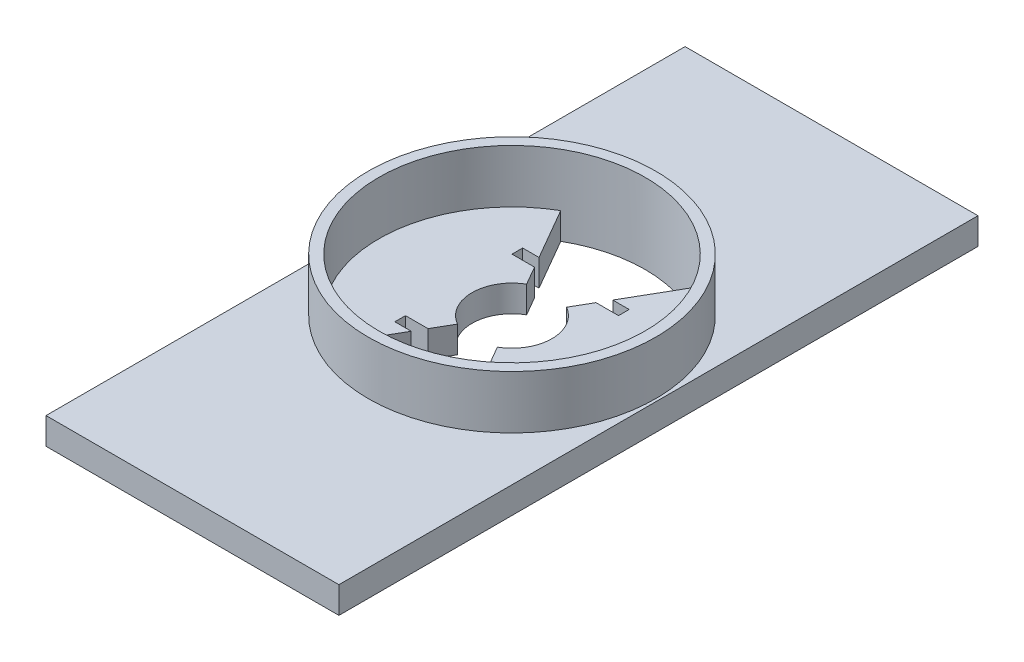
ISO-10303-21;
HEADER;
FILE_DESCRIPTION(('STEP AP214'),'2;1');
FILE_NAME('part.step','',(''),(''),'','','');
FILE_SCHEMA(('AUTOMOTIVE_DESIGN { 1 0 10303 214 1 1 1 1 }'));
ENDSEC;
DATA;
#1=APPLICATION_CONTEXT('core data for automotive mechanical design processes');
#2=APPLICATION_PROTOCOL_DEFINITION('international standard','automotive_design',2000,#1);
#3=PRODUCT_CONTEXT('',#1,'mechanical');
#4=PRODUCT('Part','Part','',(#3));
#5=PRODUCT_RELATED_PRODUCT_CATEGORY('part','',(#4));
#6=PRODUCT_DEFINITION_FORMATION('','',#4);
#7=PRODUCT_DEFINITION_CONTEXT('part definition',#1,'design');
#8=PRODUCT_DEFINITION('design','',#6,#7);
#9=PRODUCT_DEFINITION_SHAPE('','',#8);
#10=(LENGTH_UNIT() NAMED_UNIT(*) SI_UNIT(.MILLI.,.METRE.));
#11=(NAMED_UNIT(*) PLANE_ANGLE_UNIT() SI_UNIT($,.RADIAN.));
#12=(NAMED_UNIT(*) SI_UNIT($,.STERADIAN.) SOLID_ANGLE_UNIT());
#13=UNCERTAINTY_MEASURE_WITH_UNIT(LENGTH_MEASURE(1.E-05),#10,'distance_accuracy_value','');
#14=(GEOMETRIC_REPRESENTATION_CONTEXT(3) GLOBAL_UNCERTAINTY_ASSIGNED_CONTEXT((#13)) GLOBAL_UNIT_ASSIGNED_CONTEXT((#10,
#11,#12)) REPRESENTATION_CONTEXT('',''));
#15=CARTESIAN_POINT('',(0.,0.,0.));
#16=DIRECTION('',(0.,0.,1.));
#17=DIRECTION('',(1.,0.,0.));
#18=AXIS2_PLACEMENT_3D('',#15,#16,#17);
#19=CARTESIAN_POINT('',(0.,5.,0.));
#20=DIRECTION('',(0.,1.,0.));
#21=DIRECTION('',(0.,0.,1.));
#22=AXIS2_PLACEMENT_3D('',#19,#20,#21);
#23=PLANE('',#22);
#24=DIRECTION('',(0.,0.,-1.));
#25=VECTOR('',#24,1.);
#26=CARTESIAN_POINT('',(-27.5,5.,60.));
#27=LINE('',#26,#25);
#28=CARTESIAN_POINT('',(-27.5,5.,60.));
#29=VERTEX_POINT('',#28);
#30=CARTESIAN_POINT('',(-27.5,5.,-60.));
#31=VERTEX_POINT('',#30);
#32=EDGE_CURVE('E215',#29,#31,#27,.T.);
#33=ORIENTED_EDGE('',*,*,#32,.F.);
#34=DIRECTION('',(1.,0.,0.));
#35=VECTOR('',#34,1.);
#36=CARTESIAN_POINT('',(-51.,5.,60.));
#37=LINE('',#36,#35);
#38=CARTESIAN_POINT('',(27.5,5.,60.));
#39=VERTEX_POINT('',#38);
#40=EDGE_CURVE('E234',#29,#39,#37,.T.);
#41=ORIENTED_EDGE('',*,*,#40,.T.);
#42=DIRECTION('',(0.,0.,-1.));
#43=VECTOR('',#42,1.);
#44=CARTESIAN_POINT('',(27.5,5.,60.));
#45=LINE('',#44,#43);
#46=CARTESIAN_POINT('',(27.5,5.,-60.));
#47=VERTEX_POINT('',#46);
#48=EDGE_CURVE('E48',#39,#47,#45,.T.);
#49=ORIENTED_EDGE('',*,*,#48,.T.);
#50=DIRECTION('',(-1.,0.,0.));
#51=VECTOR('',#50,1.);
#52=CARTESIAN_POINT('',(-51.,5.,-60.));
#53=LINE('',#52,#51);
#54=EDGE_CURVE('E228',#47,#31,#53,.T.);
#55=ORIENTED_EDGE('',*,*,#54,.T.);
#56=EDGE_LOOP('',(#33,#41,#49,#55));
#57=FACE_BOUND('',#56,.T.);
#58=CARTESIAN_POINT('',(0.,5.,0.));
#59=DIRECTION('',(0.,1.,0.));
#60=DIRECTION('',(0.,0.,1.));
#61=AXIS2_PLACEMENT_3D('',#58,#59,#60);
#62=CIRCLE('',#61,27.);
#63=CARTESIAN_POINT('',(0.,5.,27.));
#64=VERTEX_POINT('',#63);
#65=EDGE_CURVE('E266',#64,#64,#62,.T.);
#66=ORIENTED_EDGE('',*,*,#65,.F.);
#67=EDGE_LOOP('',(#66));
#68=FACE_BOUND('',#67,.T.);
#69=ADVANCED_FACE('F33',(#57,#68),#23,.T.);
#70=CARTESIAN_POINT('',(0.,0.,0.));
#71=DIRECTION('',(0.,1.,0.));
#72=DIRECTION('',(0.,0.,1.));
#73=AXIS2_PLACEMENT_3D('',#70,#71,#72);
#74=PLANE('',#73);
#75=DIRECTION('',(0.499999999999998,0.,0.86602540378444));
#76=VECTOR('',#75,1.);
#77=CARTESIAN_POINT('',(0.,0.,0.));
#78=LINE('',#77,#76);
#79=CARTESIAN_POINT('',(6.92820323027538,0.,11.9999999999998));
#80=VERTEX_POINT('',#79);
#81=CARTESIAN_POINT('',(12.4999999999999,0.,21.650635094611));
#82=VERTEX_POINT('',#81);
#83=EDGE_CURVE('E337',#80,#82,#78,.T.);
#84=ORIENTED_EDGE('',*,*,#83,.F.);
#85=DIRECTION('',(1.,0.,0.));
#86=VECTOR('',#85,1.);
#87=CARTESIAN_POINT('',(-9.99999999999997,0.,11.9999999999998));
#88=LINE('',#87,#86);
#89=CARTESIAN_POINT('',(10.,0.,11.9999999999998));
#90=VERTEX_POINT('',#89);
#91=EDGE_CURVE('E396',#80,#90,#88,.T.);
#92=ORIENTED_EDGE('',*,*,#91,.T.);
#93=DIRECTION('',(0.,0.,-1.));
#94=VECTOR('',#93,1.);
#95=CARTESIAN_POINT('',(10.,0.,11.9999999999998));
#96=LINE('',#95,#94);
#97=CARTESIAN_POINT('',(10.,0.,9.99999999999984));
#98=VERTEX_POINT('',#97);
#99=EDGE_CURVE('E400',#90,#98,#96,.T.);
#100=ORIENTED_EDGE('',*,*,#99,.T.);
#101=DIRECTION('',(-1.,0.,0.));
#102=VECTOR('',#101,1.);
#103=CARTESIAN_POINT('',(-9.99999999999997,0.,9.99999999999984));
#104=LINE('',#103,#102);
#105=CARTESIAN_POINT('',(5.77350269189613,0.,9.99999999999984));
#106=VERTEX_POINT('',#105);
#107=EDGE_CURVE('E382',#98,#106,#104,.T.);
#108=ORIENTED_EDGE('',*,*,#107,.T.);
#109=CARTESIAN_POINT('',(3.74999999999998,0.,6.4951905283833));
#110=VERTEX_POINT('',#109);
#111=EDGE_CURVE('E334',#110,#106,#78,.T.);
#112=ORIENTED_EDGE('',*,*,#111,.F.);
#113=CARTESIAN_POINT('',(0.,0.,0.));
#114=DIRECTION('',(0.,1.,0.));
#115=DIRECTION('',(0.,0.,1.));
#116=AXIS2_PLACEMENT_3D('',#113,#114,#115);
#117=CIRCLE('',#116,7.5);
#118=CARTESIAN_POINT('',(3.75000000000002,0.,-6.49519052838328));
#119=VERTEX_POINT('',#118);
#120=EDGE_CURVE('E258',#110,#119,#117,.T.);
#121=ORIENTED_EDGE('',*,*,#120,.T.);
#122=DIRECTION('',(0.499999999999996,0.,-0.866025403784441));
#123=VECTOR('',#122,1.);
#124=CARTESIAN_POINT('',(0.,0.,0.));
#125=LINE('',#124,#123);
#126=CARTESIAN_POINT('',(5.77350269189606,0.,-9.99999999999965));
#127=VERTEX_POINT('',#126);
#128=EDGE_CURVE('E320',#119,#127,#125,.T.);
#129=ORIENTED_EDGE('',*,*,#128,.T.);
#130=DIRECTION('',(1.,0.,0.));
#131=VECTOR('',#130,1.);
#132=CARTESIAN_POINT('',(-10.,0.,-9.99999999999965));
#133=LINE('',#132,#131);
#134=CARTESIAN_POINT('',(10.,0.,-9.99999999999965));
#135=VERTEX_POINT('',#134);
#136=EDGE_CURVE('E358',#127,#135,#133,.T.);
#137=ORIENTED_EDGE('',*,*,#136,.T.);
#138=DIRECTION('',(0.,0.,-1.));
#139=VECTOR('',#138,1.);
#140=CARTESIAN_POINT('',(10.,0.,-9.99999999999965));
#141=LINE('',#140,#139);
#142=CARTESIAN_POINT('',(10.,0.,-11.9999999999997));
#143=VERTEX_POINT('',#142);
#144=EDGE_CURVE('E362',#135,#143,#141,.T.);
#145=ORIENTED_EDGE('',*,*,#144,.T.);
#146=DIRECTION('',(-1.,0.,0.));
#147=VECTOR('',#146,1.);
#148=CARTESIAN_POINT('',(-10.,0.,-11.9999999999997));
#149=LINE('',#148,#147);
#150=CARTESIAN_POINT('',(6.9282032302753,0.,-11.9999999999997));
#151=VERTEX_POINT('',#150);
#152=EDGE_CURVE('E343',#143,#151,#149,.T.);
#153=ORIENTED_EDGE('',*,*,#152,.T.);
#154=CARTESIAN_POINT('',(12.4999999999999,0.,-21.650635094611));
#155=VERTEX_POINT('',#154);
#156=EDGE_CURVE('E301',#151,#155,#125,.T.);
#157=ORIENTED_EDGE('',*,*,#156,.T.);
#158=CARTESIAN_POINT('',(0.,0.,0.));
#159=DIRECTION('',(0.,1.,0.));
#160=DIRECTION('',(0.,0.,1.));
#161=AXIS2_PLACEMENT_3D('',#158,#159,#160);
#162=CIRCLE('',#161,25.);
#163=CARTESIAN_POINT('',(-12.5000000000001,0.,-21.6506350946109));
#164=VERTEX_POINT('',#163);
#165=EDGE_CURVE('E255',#155,#164,#162,.T.);
#166=ORIENTED_EDGE('',*,*,#165,.T.);
#167=DIRECTION('',(-0.500000000000004,0.,-0.866025403784436));
#168=VECTOR('',#167,1.);
#169=CARTESIAN_POINT('',(0.,0.,0.));
#170=LINE('',#169,#168);
#171=CARTESIAN_POINT('',(-6.92820323027539,0.,-11.9999999999997));
#172=VERTEX_POINT('',#171);
#173=EDGE_CURVE('E322',#172,#164,#170,.T.);
#174=ORIENTED_EDGE('',*,*,#173,.F.);
#175=CARTESIAN_POINT('',(-10.,0.,-11.9999999999997));
#176=VERTEX_POINT('',#175);
#177=EDGE_CURVE('E365',#172,#176,#149,.T.);
#178=ORIENTED_EDGE('',*,*,#177,.T.);
#179=DIRECTION('',(0.,0.,1.));
#180=VECTOR('',#179,1.);
#181=CARTESIAN_POINT('',(-10.,0.,-9.99999999999965));
#182=LINE('',#181,#180);
#183=CARTESIAN_POINT('',(-10.,0.,-9.99999999999965));
#184=VERTEX_POINT('',#183);
#185=EDGE_CURVE('E355',#176,#184,#182,.T.);
#186=ORIENTED_EDGE('',*,*,#185,.T.);
#187=CARTESIAN_POINT('',(-5.77350269189612,0.,-9.99999999999965));
#188=VERTEX_POINT('',#187);
#189=EDGE_CURVE('E359',#184,#188,#133,.T.);
#190=ORIENTED_EDGE('',*,*,#189,.T.);
#191=CARTESIAN_POINT('',(-3.75000000000003,0.,-6.49519052838327));
#192=VERTEX_POINT('',#191);
#193=EDGE_CURVE('E325',#192,#188,#170,.T.);
#194=ORIENTED_EDGE('',*,*,#193,.F.);
#195=CARTESIAN_POINT('',(0.,0.,0.));
#196=DIRECTION('',(0.,1.,0.));
#197=DIRECTION('',(0.,0.,1.));
#198=AXIS2_PLACEMENT_3D('',#195,#196,#197);
#199=CIRCLE('',#198,7.5);
#200=CARTESIAN_POINT('',(-3.75000000000003,0.,6.49519052838327));
#201=VERTEX_POINT('',#200);
#202=EDGE_CURVE('E261',#192,#201,#199,.T.);
#203=ORIENTED_EDGE('',*,*,#202,.T.);
#204=DIRECTION('',(-0.500000000000004,0.,0.866025403784436));
#205=VECTOR('',#204,1.);
#206=CARTESIAN_POINT('',(0.,0.,0.));
#207=LINE('',#206,#205);
#208=CARTESIAN_POINT('',(-5.77350269189623,0.,9.99999999999984));
#209=VERTEX_POINT('',#208);
#210=EDGE_CURVE('E328',#201,#209,#207,.T.);
#211=ORIENTED_EDGE('',*,*,#210,.T.);
#212=CARTESIAN_POINT('',(-9.99999999999997,0.,9.99999999999984));
#213=VERTEX_POINT('',#212);
#214=EDGE_CURVE('E403',#209,#213,#104,.T.);
#215=ORIENTED_EDGE('',*,*,#214,.T.);
#216=DIRECTION('',(0.,0.,1.));
#217=VECTOR('',#216,1.);
#218=CARTESIAN_POINT('',(-9.99999999999997,0.,11.9999999999998));
#219=LINE('',#218,#217);
#220=CARTESIAN_POINT('',(-9.99999999999997,0.,11.9999999999998));
#221=VERTEX_POINT('',#220);
#222=EDGE_CURVE('E378',#213,#221,#219,.T.);
#223=ORIENTED_EDGE('',*,*,#222,.T.);
#224=CARTESIAN_POINT('',(-6.9282032302755,0.,11.9999999999998));
#225=VERTEX_POINT('',#224);
#226=EDGE_CURVE('E397',#221,#225,#88,.T.);
#227=ORIENTED_EDGE('',*,*,#226,.T.);
#228=CARTESIAN_POINT('',(-12.5000000000001,0.,21.6506350946109));
#229=VERTEX_POINT('',#228);
#230=EDGE_CURVE('E332',#225,#229,#207,.T.);
#231=ORIENTED_EDGE('',*,*,#230,.T.);
#232=CARTESIAN_POINT('',(0.,0.,0.));
#233=DIRECTION('',(0.,1.,0.));
#234=DIRECTION('',(0.,0.,1.));
#235=AXIS2_PLACEMENT_3D('',#232,#233,#234);
#236=CIRCLE('',#235,25.);
#237=EDGE_CURVE('E264',#82,#229,#236,.F.);
#238=ORIENTED_EDGE('',*,*,#237,.F.);
#239=EDGE_LOOP('',(#84,#92,#100,#108,#112,#121,#129,#137,#145,#153,#157,#166,#174,#178,#186,
#190,#194,#203,#211,#215,#223,#227,#231,#238));
#240=FACE_BOUND('',#239,.T.);
#241=DIRECTION('',(1.,0.,0.));
#242=VECTOR('',#241,1.);
#243=CARTESIAN_POINT('',(-51.,0.,60.));
#244=LINE('',#243,#242);
#245=CARTESIAN_POINT('',(-27.5,0.,60.));
#246=VERTEX_POINT('',#245);
#247=CARTESIAN_POINT('',(27.5,0.,60.));
#248=VERTEX_POINT('',#247);
#249=EDGE_CURVE('E235',#246,#248,#244,.T.);
#250=ORIENTED_EDGE('',*,*,#249,.F.);
#251=DIRECTION('',(0.,0.,-1.));
#252=VECTOR('',#251,1.);
#253=CARTESIAN_POINT('',(-27.5,0.,0.));
#254=LINE('',#253,#252);
#255=CARTESIAN_POINT('',(-27.5,0.,-60.));
#256=VERTEX_POINT('',#255);
#257=EDGE_CURVE('E56',#246,#256,#254,.T.);
#258=ORIENTED_EDGE('',*,*,#257,.T.);
#259=DIRECTION('',(-1.,0.,0.));
#260=VECTOR('',#259,1.);
#261=CARTESIAN_POINT('',(-51.,0.,-60.));
#262=LINE('',#261,#260);
#263=CARTESIAN_POINT('',(27.5,0.,-60.));
#264=VERTEX_POINT('',#263);
#265=EDGE_CURVE('E230',#264,#256,#262,.T.);
#266=ORIENTED_EDGE('',*,*,#265,.F.);
#267=DIRECTION('',(0.,0.,-1.));
#268=VECTOR('',#267,1.);
#269=CARTESIAN_POINT('',(27.5,0.,0.));
#270=LINE('',#269,#268);
#271=EDGE_CURVE('E231',#248,#264,#270,.T.);
#272=ORIENTED_EDGE('',*,*,#271,.F.);
#273=EDGE_LOOP('',(#250,#258,#266,#272));
#274=FACE_BOUND('',#273,.T.);
#275=ADVANCED_FACE('F426',(#240,#274),#74,.F.);
#276=CARTESIAN_POINT('',(-51.,5.,-60.));
#277=DIRECTION('',(0.,0.,1.));
#278=DIRECTION('',(1.,0.,0.));
#279=AXIS2_PLACEMENT_3D('',#276,#277,#278);
#280=PLANE('',#279);
#281=ORIENTED_EDGE('',*,*,#265,.T.);
#282=DIRECTION('',(0.,1.,0.));
#283=VECTOR('',#282,1.);
#284=CARTESIAN_POINT('',(-27.5,-5.,-60.));
#285=LINE('',#284,#283);
#286=EDGE_CURVE('E218',#256,#31,#285,.T.);
#287=ORIENTED_EDGE('',*,*,#286,.T.);
#288=ORIENTED_EDGE('',*,*,#54,.F.);
#289=DIRECTION('',(0.,1.,0.));
#290=VECTOR('',#289,1.);
#291=CARTESIAN_POINT('',(27.5,-5.,-60.));
#292=LINE('',#291,#290);
#293=EDGE_CURVE('E750',#264,#47,#292,.T.);
#294=ORIENTED_EDGE('',*,*,#293,.F.);
#295=EDGE_LOOP('',(#281,#287,#288,#294));
#296=FACE_BOUND('',#295,.T.);
#297=ADVANCED_FACE('F35',(#296),#280,.F.);
#298=CARTESIAN_POINT('',(-51.,5.,60.));
#299=DIRECTION('',(0.,0.,-1.));
#300=DIRECTION('',(-1.,0.,0.));
#301=AXIS2_PLACEMENT_3D('',#298,#299,#300);
#302=PLANE('',#301);
#303=ORIENTED_EDGE('',*,*,#40,.F.);
#304=DIRECTION('',(0.,-1.,0.));
#305=VECTOR('',#304,1.);
#306=CARTESIAN_POINT('',(-27.5,5.,60.));
#307=LINE('',#306,#305);
#308=EDGE_CURVE('E11',#29,#246,#307,.T.);
#309=ORIENTED_EDGE('',*,*,#308,.T.);
#310=ORIENTED_EDGE('',*,*,#249,.T.);
#311=DIRECTION('',(0.,-1.,0.));
#312=VECTOR('',#311,1.);
#313=CARTESIAN_POINT('',(27.5,5.,60.));
#314=LINE('',#313,#312);
#315=EDGE_CURVE('E41',#39,#248,#314,.T.);
#316=ORIENTED_EDGE('',*,*,#315,.F.);
#317=EDGE_LOOP('',(#303,#309,#310,#316));
#318=FACE_BOUND('',#317,.T.);
#319=ADVANCED_FACE('F545',(#318),#302,.F.);
#320=DIRECTION('',(0.499999999999998,0.,0.86602540378444));
#321=VECTOR('',#320,1.);
#322=CARTESIAN_POINT('',(3.74999999999998,5.,6.4951905283833));
#323=LINE('',#322,#321);
#324=CARTESIAN_POINT('',(6.92820323027538,5.,11.9999999999998));
#325=VERTEX_POINT('',#324);
#326=CARTESIAN_POINT('',(12.4999999999999,5.,21.650635094611));
#327=VERTEX_POINT('',#326);
#328=EDGE_CURVE('E294',#325,#327,#323,.T.);
#329=ORIENTED_EDGE('',*,*,#328,.T.);
#330=CARTESIAN_POINT('',(0.,5.,0.));
#331=DIRECTION('',(0.,1.,0.));
#332=DIRECTION('',(0.,0.,1.));
#333=AXIS2_PLACEMENT_3D('',#330,#331,#332);
#334=CIRCLE('',#333,25.);
#335=CARTESIAN_POINT('',(12.4999999999999,5.,-21.650635094611));
#336=VERTEX_POINT('',#335);
#337=EDGE_CURVE('E274',#327,#336,#334,.T.);
#338=ORIENTED_EDGE('',*,*,#337,.T.);
#339=DIRECTION('',(0.499999999999996,0.,-0.866025403784441));
#340=VECTOR('',#339,1.);
#341=CARTESIAN_POINT('',(3.75000000000002,5.,-6.49519052838328));
#342=LINE('',#341,#340);
#343=CARTESIAN_POINT('',(6.9282032302753,5.,-11.9999999999997));
#344=VERTEX_POINT('',#343);
#345=EDGE_CURVE('E281',#344,#336,#342,.T.);
#346=ORIENTED_EDGE('',*,*,#345,.F.);
#347=DIRECTION('',(-1.,0.,0.));
#348=VECTOR('',#347,1.);
#349=CARTESIAN_POINT('',(-10.,5.,-11.9999999999997));
#350=LINE('',#349,#348);
#351=CARTESIAN_POINT('',(10.,5.,-11.9999999999997));
#352=VERTEX_POINT('',#351);
#353=EDGE_CURVE('E351',#352,#344,#350,.T.);
#354=ORIENTED_EDGE('',*,*,#353,.F.);
#355=DIRECTION('',(0.,0.,-1.));
#356=VECTOR('',#355,1.);
#357=CARTESIAN_POINT('',(10.,5.,-9.99999999999965));
#358=LINE('',#357,#356);
#359=CARTESIAN_POINT('',(10.,5.,-9.99999999999965));
#360=VERTEX_POINT('',#359);
#361=EDGE_CURVE('E347',#360,#352,#358,.T.);
#362=ORIENTED_EDGE('',*,*,#361,.F.);
#363=DIRECTION('',(1.,0.,0.));
#364=VECTOR('',#363,1.);
#365=CARTESIAN_POINT('',(-10.,5.,-9.99999999999965));
#366=LINE('',#365,#364);
#367=CARTESIAN_POINT('',(5.77350269189606,5.,-9.99999999999965));
#368=VERTEX_POINT('',#367);
#369=EDGE_CURVE('E342',#368,#360,#366,.T.);
#370=ORIENTED_EDGE('',*,*,#369,.F.);
#371=CARTESIAN_POINT('',(3.75000000000002,5.,-6.49519052838328));
#372=VERTEX_POINT('',#371);
#373=EDGE_CURVE('E282',#372,#368,#342,.T.);
#374=ORIENTED_EDGE('',*,*,#373,.F.);
#375=CARTESIAN_POINT('',(0.,5.,0.));
#376=DIRECTION('',(0.,1.,0.));
#377=DIRECTION('',(0.,0.,1.));
#378=AXIS2_PLACEMENT_3D('',#375,#376,#377);
#379=CIRCLE('',#378,7.5);
#380=CARTESIAN_POINT('',(3.74999999999998,5.,6.4951905283833));
#381=VERTEX_POINT('',#380);
#382=EDGE_CURVE('E278',#381,#372,#379,.T.);
#383=ORIENTED_EDGE('',*,*,#382,.F.);
#384=CARTESIAN_POINT('',(5.77350269189613,5.,9.99999999999984));
#385=VERTEX_POINT('',#384);
#386=EDGE_CURVE('E295',#381,#385,#323,.T.);
#387=ORIENTED_EDGE('',*,*,#386,.T.);
#388=DIRECTION('',(-1.,0.,0.));
#389=VECTOR('',#388,1.);
#390=CARTESIAN_POINT('',(-9.99999999999997,5.,9.99999999999984));
#391=LINE('',#390,#389);
#392=CARTESIAN_POINT('',(10.,5.,9.99999999999984));
#393=VERTEX_POINT('',#392);
#394=EDGE_CURVE('E390',#393,#385,#391,.T.);
#395=ORIENTED_EDGE('',*,*,#394,.F.);
#396=DIRECTION('',(0.,0.,-1.));
#397=VECTOR('',#396,1.);
#398=CARTESIAN_POINT('',(10.,5.,11.9999999999998));
#399=LINE('',#398,#397);
#400=CARTESIAN_POINT('',(10.,5.,11.9999999999998));
#401=VERTEX_POINT('',#400);
#402=EDGE_CURVE('E386',#401,#393,#399,.T.);
#403=ORIENTED_EDGE('',*,*,#402,.F.);
#404=DIRECTION('',(1.,0.,0.));
#405=VECTOR('',#404,1.);
#406=CARTESIAN_POINT('',(-9.99999999999997,5.,11.9999999999998));
#407=LINE('',#406,#405);
#408=EDGE_CURVE('E381',#325,#401,#407,.T.);
#409=ORIENTED_EDGE('',*,*,#408,.F.);
#410=EDGE_LOOP('',(#329,#338,#346,#354,#362,#370,#374,#383,#387,#395,#403,#409));
#411=FACE_BOUND('',#410,.T.);
#412=ADVANCED_FACE('F456',(#411),#23,.T.);
#413=DIRECTION('',(-0.500000000000004,0.,-0.866025403784436));
#414=VECTOR('',#413,1.);
#415=CARTESIAN_POINT('',(-3.75000000000003,5.,-6.49519052838327));
#416=LINE('',#415,#414);
#417=CARTESIAN_POINT('',(-6.92820323027539,5.,-11.9999999999997));
#418=VERTEX_POINT('',#417);
#419=CARTESIAN_POINT('',(-12.5000000000001,5.,-21.6506350946109));
#420=VERTEX_POINT('',#419);
#421=EDGE_CURVE('E284',#418,#420,#416,.T.);
#422=ORIENTED_EDGE('',*,*,#421,.T.);
#423=CARTESIAN_POINT('',(-12.5000000000001,5.,21.6506350946109));
#424=VERTEX_POINT('',#423);
#425=EDGE_CURVE('E265',#420,#424,#334,.T.);
#426=ORIENTED_EDGE('',*,*,#425,.T.);
#427=DIRECTION('',(-0.500000000000004,0.,0.866025403784436));
#428=VECTOR('',#427,1.);
#429=CARTESIAN_POINT('',(-3.75000000000003,5.,6.49519052838327));
#430=LINE('',#429,#428);
#431=CARTESIAN_POINT('',(-6.9282032302755,5.,11.9999999999998));
#432=VERTEX_POINT('',#431);
#433=EDGE_CURVE('E291',#432,#424,#430,.T.);
#434=ORIENTED_EDGE('',*,*,#433,.F.);
#435=CARTESIAN_POINT('',(-9.99999999999997,5.,11.9999999999998));
#436=VERTEX_POINT('',#435);
#437=EDGE_CURVE('E383',#436,#432,#407,.T.);
#438=ORIENTED_EDGE('',*,*,#437,.F.);
#439=DIRECTION('',(0.,0.,1.));
#440=VECTOR('',#439,1.);
#441=CARTESIAN_POINT('',(-9.99999999999997,5.,11.9999999999998));
#442=LINE('',#441,#440);
#443=CARTESIAN_POINT('',(-9.99999999999997,5.,9.99999999999984));
#444=VERTEX_POINT('',#443);
#445=EDGE_CURVE('E379',#444,#436,#442,.T.);
#446=ORIENTED_EDGE('',*,*,#445,.F.);
#447=CARTESIAN_POINT('',(-5.77350269189623,5.,9.99999999999984));
#448=VERTEX_POINT('',#447);
#449=EDGE_CURVE('E389',#448,#444,#391,.T.);
#450=ORIENTED_EDGE('',*,*,#449,.F.);
#451=CARTESIAN_POINT('',(-3.75000000000003,5.,6.49519052838327));
#452=VERTEX_POINT('',#451);
#453=EDGE_CURVE('E292',#452,#448,#430,.T.);
#454=ORIENTED_EDGE('',*,*,#453,.F.);
#455=CARTESIAN_POINT('',(0.,5.,0.));
#456=DIRECTION('',(0.,1.,0.));
#457=DIRECTION('',(0.,0.,1.));
#458=AXIS2_PLACEMENT_3D('',#455,#456,#457);
#459=CIRCLE('',#458,7.5);
#460=CARTESIAN_POINT('',(-3.75000000000003,5.,-6.49519052838327));
#461=VERTEX_POINT('',#460);
#462=EDGE_CURVE('E288',#461,#452,#459,.T.);
#463=ORIENTED_EDGE('',*,*,#462,.F.);
#464=CARTESIAN_POINT('',(-5.77350269189612,5.,-9.99999999999965));
#465=VERTEX_POINT('',#464);
#466=EDGE_CURVE('E285',#461,#465,#416,.T.);
#467=ORIENTED_EDGE('',*,*,#466,.T.);
#468=CARTESIAN_POINT('',(-10.,5.,-9.99999999999965));
#469=VERTEX_POINT('',#468);
#470=EDGE_CURVE('E344',#469,#465,#366,.T.);
#471=ORIENTED_EDGE('',*,*,#470,.F.);
#472=DIRECTION('',(0.,0.,1.));
#473=VECTOR('',#472,1.);
#474=CARTESIAN_POINT('',(-10.,5.,-9.99999999999965));
#475=LINE('',#474,#473);
#476=CARTESIAN_POINT('',(-10.,5.,-11.9999999999997));
#477=VERTEX_POINT('',#476);
#478=EDGE_CURVE('E340',#477,#469,#475,.T.);
#479=ORIENTED_EDGE('',*,*,#478,.F.);
#480=EDGE_CURVE('E350',#418,#477,#350,.T.);
#481=ORIENTED_EDGE('',*,*,#480,.F.);
#482=EDGE_LOOP('',(#422,#426,#434,#438,#446,#450,#454,#463,#467,#471,#479,#481));
#483=FACE_BOUND('',#482,.T.);
#484=ADVANCED_FACE('F436',(#483),#23,.T.);
#485=CARTESIAN_POINT('',(-9.99999999999997,5.,11.9999999999998));
#486=DIRECTION('',(0.,0.,-1.));
#487=DIRECTION('',(-1.,0.,0.));
#488=AXIS2_PLACEMENT_3D('',#485,#486,#487);
#489=PLANE('',#488);
#490=ORIENTED_EDGE('',*,*,#91,.F.);
#491=DIRECTION('',(0.,1.,0.));
#492=VECTOR('',#491,1.);
#493=CARTESIAN_POINT('',(6.92820323027538,5.,11.9999999999998));
#494=LINE('',#493,#492);
#495=EDGE_CURVE('E336',#80,#325,#494,.T.);
#496=ORIENTED_EDGE('',*,*,#495,.T.);
#497=ORIENTED_EDGE('',*,*,#408,.T.);
#498=DIRECTION('',(0.,-1.,0.));
#499=VECTOR('',#498,1.);
#500=CARTESIAN_POINT('',(10.,5.,11.9999999999998));
#501=LINE('',#500,#499);
#502=EDGE_CURVE('E409',#401,#90,#501,.T.);
#503=ORIENTED_EDGE('',*,*,#502,.T.);
#504=EDGE_LOOP('',(#490,#496,#497,#503));
#505=FACE_BOUND('',#504,.T.);
#506=ADVANCED_FACE('F460',(#505),#489,.T.);
#507=CARTESIAN_POINT('',(-9.99999999999997,5.,9.99999999999984));
#508=DIRECTION('',(0.,0.,1.));
#509=DIRECTION('',(1.,0.,0.));
#510=AXIS2_PLACEMENT_3D('',#507,#508,#509);
#511=PLANE('',#510);
#512=ORIENTED_EDGE('',*,*,#394,.T.);
#513=DIRECTION('',(0.,-1.,0.));
#514=VECTOR('',#513,1.);
#515=CARTESIAN_POINT('',(5.77350269189613,5.,9.99999999999984));
#516=LINE('',#515,#514);
#517=EDGE_CURVE('E252',#385,#106,#516,.T.);
#518=ORIENTED_EDGE('',*,*,#517,.T.);
#519=ORIENTED_EDGE('',*,*,#107,.F.);
#520=DIRECTION('',(0.,-1.,0.));
#521=VECTOR('',#520,1.);
#522=CARTESIAN_POINT('',(10.,5.,9.99999999999984));
#523=LINE('',#522,#521);
#524=EDGE_CURVE('E408',#393,#98,#523,.T.);
#525=ORIENTED_EDGE('',*,*,#524,.F.);
#526=EDGE_LOOP('',(#512,#518,#519,#525));
#527=FACE_BOUND('',#526,.T.);
#528=ADVANCED_FACE('F466',(#527),#511,.T.);
#529=CARTESIAN_POINT('',(-10.,5.,-9.99999999999965));
#530=DIRECTION('',(0.,0.,-1.));
#531=DIRECTION('',(-1.,0.,0.));
#532=AXIS2_PLACEMENT_3D('',#529,#530,#531);
#533=PLANE('',#532);
#534=ORIENTED_EDGE('',*,*,#470,.T.);
#535=DIRECTION('',(0.,-1.,0.));
#536=VECTOR('',#535,1.);
#537=CARTESIAN_POINT('',(-5.77350269189612,5.,-9.99999999999965));
#538=LINE('',#537,#536);
#539=EDGE_CURVE('E324',#465,#188,#538,.T.);
#540=ORIENTED_EDGE('',*,*,#539,.T.);
#541=ORIENTED_EDGE('',*,*,#189,.F.);
#542=DIRECTION('',(0.,-1.,0.));
#543=VECTOR('',#542,1.);
#544=CARTESIAN_POINT('',(-10.,5.,-9.99999999999965));
#545=LINE('',#544,#543);
#546=EDGE_CURVE('E375',#469,#184,#545,.T.);
#547=ORIENTED_EDGE('',*,*,#546,.F.);
#548=EDGE_LOOP('',(#534,#540,#541,#547));
#549=FACE_BOUND('',#548,.T.);
#550=ADVANCED_FACE('F514',(#549),#533,.T.);
#551=CARTESIAN_POINT('',(-10.,5.,-11.9999999999997));
#552=DIRECTION('',(0.,0.,1.));
#553=DIRECTION('',(1.,0.,0.));
#554=AXIS2_PLACEMENT_3D('',#551,#552,#553);
#555=PLANE('',#554);
#556=ORIENTED_EDGE('',*,*,#177,.F.);
#557=DIRECTION('',(0.,1.,0.));
#558=VECTOR('',#557,1.);
#559=CARTESIAN_POINT('',(-6.92820323027539,5.,-11.9999999999997));
#560=LINE('',#559,#558);
#561=EDGE_CURVE('E247',#172,#418,#560,.T.);
#562=ORIENTED_EDGE('',*,*,#561,.T.);
#563=ORIENTED_EDGE('',*,*,#480,.T.);
#564=DIRECTION('',(0.,-1.,0.));
#565=VECTOR('',#564,1.);
#566=CARTESIAN_POINT('',(-10.,5.,-11.9999999999997));
#567=LINE('',#566,#565);
#568=EDGE_CURVE('E354',#477,#176,#567,.T.);
#569=ORIENTED_EDGE('',*,*,#568,.T.);
#570=EDGE_LOOP('',(#556,#562,#563,#569));
#571=FACE_BOUND('',#570,.T.);
#572=ADVANCED_FACE('F503',(#571),#555,.T.);
#573=CARTESIAN_POINT('',(-9.99999999999997,5.,11.9999999999998));
#574=DIRECTION('',(1.,0.,0.));
#575=DIRECTION('',(0.,0.,-1.));
#576=AXIS2_PLACEMENT_3D('',#573,#574,#575);
#577=PLANE('',#576);
#578=ORIENTED_EDGE('',*,*,#222,.F.);
#579=DIRECTION('',(0.,-1.,0.));
#580=VECTOR('',#579,1.);
#581=CARTESIAN_POINT('',(-9.99999999999997,5.,9.99999999999984));
#582=LINE('',#581,#580);
#583=EDGE_CURVE('E393',#444,#213,#582,.T.);
#584=ORIENTED_EDGE('',*,*,#583,.F.);
#585=ORIENTED_EDGE('',*,*,#445,.T.);
#586=DIRECTION('',(0.,-1.,0.));
#587=VECTOR('',#586,1.);
#588=CARTESIAN_POINT('',(-9.99999999999997,5.,11.9999999999998));
#589=LINE('',#588,#587);
#590=EDGE_CURVE('E242',#436,#221,#589,.T.);
#591=ORIENTED_EDGE('',*,*,#590,.T.);
#592=EDGE_LOOP('',(#578,#584,#585,#591));
#593=FACE_BOUND('',#592,.T.);
#594=ADVANCED_FACE('F419',(#593),#577,.T.);
#595=DIRECTION('',(0.,1.,0.));
#596=VECTOR('',#595,1.);
#597=CARTESIAN_POINT('',(-6.9282032302755,5.,11.9999999999998));
#598=LINE('',#597,#596);
#599=EDGE_CURVE('E331',#225,#432,#598,.T.);
#600=ORIENTED_EDGE('',*,*,#599,.F.);
#601=ORIENTED_EDGE('',*,*,#226,.F.);
#602=ORIENTED_EDGE('',*,*,#590,.F.);
#603=ORIENTED_EDGE('',*,*,#437,.T.);
#604=EDGE_LOOP('',(#600,#601,#602,#603));
#605=FACE_BOUND('',#604,.T.);
#606=ADVANCED_FACE('F440',(#605),#489,.T.);
#607=CARTESIAN_POINT('',(10.,5.,11.9999999999998));
#608=DIRECTION('',(-1.,0.,0.));
#609=DIRECTION('',(0.,0.,1.));
#610=AXIS2_PLACEMENT_3D('',#607,#608,#609);
#611=PLANE('',#610);
#612=ORIENTED_EDGE('',*,*,#99,.F.);
#613=ORIENTED_EDGE('',*,*,#502,.F.);
#614=ORIENTED_EDGE('',*,*,#402,.T.);
#615=ORIENTED_EDGE('',*,*,#524,.T.);
#616=EDGE_LOOP('',(#612,#613,#614,#615));
#617=FACE_BOUND('',#616,.T.);
#618=ADVANCED_FACE('F462',(#617),#611,.T.);
#619=DIRECTION('',(0.,-1.,0.));
#620=VECTOR('',#619,1.);
#621=CARTESIAN_POINT('',(-5.77350269189623,5.,9.99999999999984));
#622=LINE('',#621,#620);
#623=EDGE_CURVE('E250',#448,#209,#622,.T.);
#624=ORIENTED_EDGE('',*,*,#623,.F.);
#625=ORIENTED_EDGE('',*,*,#449,.T.);
#626=ORIENTED_EDGE('',*,*,#583,.T.);
#627=ORIENTED_EDGE('',*,*,#214,.F.);
#628=EDGE_LOOP('',(#624,#625,#626,#627));
#629=FACE_BOUND('',#628,.T.);
#630=ADVANCED_FACE('F432',(#629),#511,.T.);
#631=CARTESIAN_POINT('',(-10.,5.,-9.99999999999965));
#632=DIRECTION('',(1.,0.,0.));
#633=DIRECTION('',(0.,0.,-1.));
#634=AXIS2_PLACEMENT_3D('',#631,#632,#633);
#635=PLANE('',#634);
#636=ORIENTED_EDGE('',*,*,#185,.F.);
#637=ORIENTED_EDGE('',*,*,#568,.F.);
#638=ORIENTED_EDGE('',*,*,#478,.T.);
#639=ORIENTED_EDGE('',*,*,#546,.T.);
#640=EDGE_LOOP('',(#636,#637,#638,#639));
#641=FACE_BOUND('',#640,.T.);
#642=ADVANCED_FACE('F508',(#641),#635,.T.);
#643=DIRECTION('',(0.,-1.,0.));
#644=VECTOR('',#643,1.);
#645=CARTESIAN_POINT('',(5.77350269189606,5.,-9.99999999999965));
#646=LINE('',#645,#644);
#647=EDGE_CURVE('E319',#368,#127,#646,.T.);
#648=ORIENTED_EDGE('',*,*,#647,.F.);
#649=ORIENTED_EDGE('',*,*,#369,.T.);
#650=DIRECTION('',(0.,-1.,0.));
#651=VECTOR('',#650,1.);
#652=CARTESIAN_POINT('',(10.,5.,-9.99999999999965));
#653=LINE('',#652,#651);
#654=EDGE_CURVE('E372',#360,#135,#653,.T.);
#655=ORIENTED_EDGE('',*,*,#654,.T.);
#656=ORIENTED_EDGE('',*,*,#136,.F.);
#657=EDGE_LOOP('',(#648,#649,#655,#656));
#658=FACE_BOUND('',#657,.T.);
#659=ADVANCED_FACE('F482',(#658),#533,.T.);
#660=CARTESIAN_POINT('',(10.,5.,-9.99999999999965));
#661=DIRECTION('',(-1.,0.,0.));
#662=DIRECTION('',(0.,0.,1.));
#663=AXIS2_PLACEMENT_3D('',#660,#661,#662);
#664=PLANE('',#663);
#665=ORIENTED_EDGE('',*,*,#144,.F.);
#666=ORIENTED_EDGE('',*,*,#654,.F.);
#667=ORIENTED_EDGE('',*,*,#361,.T.);
#668=DIRECTION('',(0.,-1.,0.));
#669=VECTOR('',#668,1.);
#670=CARTESIAN_POINT('',(10.,5.,-11.9999999999997));
#671=LINE('',#670,#669);
#672=EDGE_CURVE('E370',#352,#143,#671,.T.);
#673=ORIENTED_EDGE('',*,*,#672,.T.);
#674=EDGE_LOOP('',(#665,#666,#667,#673));
#675=FACE_BOUND('',#674,.T.);
#676=ADVANCED_FACE('F487',(#675),#664,.T.);
#677=DIRECTION('',(0.,1.,0.));
#678=VECTOR('',#677,1.);
#679=CARTESIAN_POINT('',(6.9282032302753,5.,-11.9999999999997));
#680=LINE('',#679,#678);
#681=EDGE_CURVE('E237',#151,#344,#680,.T.);
#682=ORIENTED_EDGE('',*,*,#681,.F.);
#683=ORIENTED_EDGE('',*,*,#152,.F.);
#684=ORIENTED_EDGE('',*,*,#672,.F.);
#685=ORIENTED_EDGE('',*,*,#353,.T.);
#686=EDGE_LOOP('',(#682,#683,#684,#685));
#687=FACE_BOUND('',#686,.T.);
#688=ADVANCED_FACE('F491',(#687),#555,.T.);
#689=CARTESIAN_POINT('',(-3.75000000000003,-5.,-6.49519052838327));
#690=DIRECTION('',(0.866025403784436,0.,-0.500000000000004));
#691=DIRECTION('',(-0.500000000000004,0.,-0.866025403784436));
#692=AXIS2_PLACEMENT_3D('',#689,#690,#691);
#693=PLANE('',#692);
#694=ORIENTED_EDGE('',*,*,#173,.T.);
#695=DIRECTION('',(0.,1.,0.));
#696=VECTOR('',#695,1.);
#697=CARTESIAN_POINT('',(-12.5000000000001,-5.,-21.6506350946109));
#698=LINE('',#697,#696);
#699=EDGE_CURVE('E311',#164,#420,#698,.T.);
#700=ORIENTED_EDGE('',*,*,#699,.T.);
#701=ORIENTED_EDGE('',*,*,#421,.F.);
#702=ORIENTED_EDGE('',*,*,#561,.F.);
#703=EDGE_LOOP('',(#694,#700,#701,#702));
#704=FACE_BOUND('',#703,.T.);
#705=ADVANCED_FACE('F531',(#704),#693,.T.);
#706=CARTESIAN_POINT('',(3.75000000000002,-5.,-6.49519052838328));
#707=DIRECTION('',(0.866025403784441,0.,0.499999999999996));
#708=DIRECTION('',(0.499999999999996,0.,-0.866025403784441));
#709=AXIS2_PLACEMENT_3D('',#706,#707,#708);
#710=PLANE('',#709);
#711=ORIENTED_EDGE('',*,*,#681,.T.);
#712=ORIENTED_EDGE('',*,*,#345,.T.);
#713=DIRECTION('',(0.,1.,0.));
#714=VECTOR('',#713,1.);
#715=CARTESIAN_POINT('',(12.4999999999999,-5.,-21.650635094611));
#716=LINE('',#715,#714);
#717=EDGE_CURVE('E313',#155,#336,#716,.T.);
#718=ORIENTED_EDGE('',*,*,#717,.F.);
#719=ORIENTED_EDGE('',*,*,#156,.F.);
#720=EDGE_LOOP('',(#711,#712,#718,#719));
#721=FACE_BOUND('',#720,.T.);
#722=ADVANCED_FACE('F495',(#721),#710,.F.);
#723=DIRECTION('',(0.,1.,0.));
#724=VECTOR('',#723,1.);
#725=CARTESIAN_POINT('',(3.75000000000002,-5.,-6.49519052838328));
#726=LINE('',#725,#724);
#727=EDGE_CURVE('E298',#119,#372,#726,.T.);
#728=ORIENTED_EDGE('',*,*,#727,.T.);
#729=ORIENTED_EDGE('',*,*,#373,.T.);
#730=ORIENTED_EDGE('',*,*,#647,.T.);
#731=ORIENTED_EDGE('',*,*,#128,.F.);
#732=EDGE_LOOP('',(#728,#729,#730,#731));
#733=FACE_BOUND('',#732,.T.);
#734=ADVANCED_FACE('F604',(#733),#710,.F.);
#735=CARTESIAN_POINT('',(3.74999999999998,-5.,6.4951905283833));
#736=DIRECTION('',(-0.86602540378444,0.,0.499999999999998));
#737=DIRECTION('',(0.499999999999998,0.,0.86602540378444));
#738=AXIS2_PLACEMENT_3D('',#735,#736,#737);
#739=PLANE('',#738);
#740=ORIENTED_EDGE('',*,*,#111,.T.);
#741=ORIENTED_EDGE('',*,*,#517,.F.);
#742=ORIENTED_EDGE('',*,*,#386,.F.);
#743=DIRECTION('',(0.,1.,0.));
#744=VECTOR('',#743,1.);
#745=CARTESIAN_POINT('',(3.74999999999998,-5.,6.4951905283833));
#746=LINE('',#745,#744);
#747=EDGE_CURVE('E299',#110,#381,#746,.T.);
#748=ORIENTED_EDGE('',*,*,#747,.F.);
#749=EDGE_LOOP('',(#740,#741,#742,#748));
#750=FACE_BOUND('',#749,.T.);
#751=ADVANCED_FACE('F469',(#750),#739,.T.);
#752=CARTESIAN_POINT('',(0.,-5.,0.));
#753=DIRECTION('',(0.,1.,0.));
#754=DIRECTION('',(0.,0.,1.));
#755=AXIS2_PLACEMENT_3D('',#752,#753,#754);
#756=CYLINDRICAL_SURFACE('',#755,7.5);
#757=ORIENTED_EDGE('',*,*,#747,.T.);
#758=ORIENTED_EDGE('',*,*,#382,.T.);
#759=ORIENTED_EDGE('',*,*,#727,.F.);
#760=ORIENTED_EDGE('',*,*,#120,.F.);
#761=EDGE_LOOP('',(#757,#758,#759,#760));
#762=FACE_BOUND('',#761,.T.);
#763=ADVANCED_FACE('F476',(#762),#756,.F.);
#764=CARTESIAN_POINT('',(-3.75000000000003,-5.,6.49519052838327));
#765=DIRECTION('',(-0.866025403784436,0.,-0.500000000000004));
#766=DIRECTION('',(-0.500000000000004,0.,0.866025403784436));
#767=AXIS2_PLACEMENT_3D('',#764,#765,#766);
#768=PLANE('',#767);
#769=DIRECTION('',(0.,1.,0.));
#770=VECTOR('',#769,1.);
#771=CARTESIAN_POINT('',(-3.75000000000003,-5.,6.49519052838327));
#772=LINE('',#771,#770);
#773=EDGE_CURVE('E307',#201,#452,#772,.T.);
#774=ORIENTED_EDGE('',*,*,#773,.T.);
#775=ORIENTED_EDGE('',*,*,#453,.T.);
#776=ORIENTED_EDGE('',*,*,#623,.T.);
#777=ORIENTED_EDGE('',*,*,#210,.F.);
#778=EDGE_LOOP('',(#774,#775,#776,#777));
#779=FACE_BOUND('',#778,.T.);
#780=ADVANCED_FACE('F523',(#779),#768,.F.);
#781=ORIENTED_EDGE('',*,*,#193,.T.);
#782=ORIENTED_EDGE('',*,*,#539,.F.);
#783=ORIENTED_EDGE('',*,*,#466,.F.);
#784=DIRECTION('',(0.,1.,0.));
#785=VECTOR('',#784,1.);
#786=CARTESIAN_POINT('',(-3.75000000000003,-5.,-6.49519052838327));
#787=LINE('',#786,#785);
#788=EDGE_CURVE('E309',#192,#461,#787,.T.);
#789=ORIENTED_EDGE('',*,*,#788,.F.);
#790=EDGE_LOOP('',(#781,#782,#783,#789));
#791=FACE_BOUND('',#790,.T.);
#792=ADVANCED_FACE('F518',(#791),#693,.T.);
#793=CARTESIAN_POINT('',(0.,-5.,0.));
#794=DIRECTION('',(0.,1.,0.));
#795=DIRECTION('',(0.,0.,1.));
#796=AXIS2_PLACEMENT_3D('',#793,#794,#795);
#797=CYLINDRICAL_SURFACE('',#796,7.5);
#798=ORIENTED_EDGE('',*,*,#788,.T.);
#799=ORIENTED_EDGE('',*,*,#462,.T.);
#800=ORIENTED_EDGE('',*,*,#773,.F.);
#801=ORIENTED_EDGE('',*,*,#202,.F.);
#802=EDGE_LOOP('',(#798,#799,#800,#801));
#803=FACE_BOUND('',#802,.T.);
#804=ADVANCED_FACE('F520',(#803),#797,.F.);
#805=CARTESIAN_POINT('',(0.,-5.,0.));
#806=DIRECTION('',(0.,1.,0.));
#807=DIRECTION('',(0.,0.,1.));
#808=AXIS2_PLACEMENT_3D('',#805,#806,#807);
#809=CYLINDRICAL_SURFACE('',#808,25.);
#810=ORIENTED_EDGE('',*,*,#237,.T.);
#811=DIRECTION('',(0.,1.,0.));
#812=VECTOR('',#811,1.);
#813=CARTESIAN_POINT('',(-12.5000000000001,-5.,21.6506350946109));
#814=LINE('',#813,#812);
#815=EDGE_CURVE('E304',#229,#424,#814,.T.);
#816=ORIENTED_EDGE('',*,*,#815,.T.);
#817=ORIENTED_EDGE('',*,*,#425,.F.);
#818=ORIENTED_EDGE('',*,*,#699,.F.);
#819=ORIENTED_EDGE('',*,*,#165,.F.);
#820=ORIENTED_EDGE('',*,*,#717,.T.);
#821=ORIENTED_EDGE('',*,*,#337,.F.);
#822=DIRECTION('',(0.,1.,0.));
#823=VECTOR('',#822,1.);
#824=CARTESIAN_POINT('',(12.4999999999999,-5.,21.650635094611));
#825=LINE('',#824,#823);
#826=EDGE_CURVE('E302',#82,#327,#825,.T.);
#827=ORIENTED_EDGE('',*,*,#826,.F.);
#828=EDGE_LOOP('',(#810,#816,#817,#818,#819,#820,#821,#827));
#829=FACE_BOUND('',#828,.T.);
#830=CARTESIAN_POINT('',(0.,15.,0.));
#831=DIRECTION('',(0.,1.,0.));
#832=DIRECTION('',(0.,0.,1.));
#833=AXIS2_PLACEMENT_3D('',#830,#831,#832);
#834=CIRCLE('',#833,25.);
#835=CARTESIAN_POINT('',(0.,15.,25.));
#836=VERTEX_POINT('',#835);
#837=EDGE_CURVE('E755',#836,#836,#834,.T.);
#838=ORIENTED_EDGE('',*,*,#837,.T.);
#839=EDGE_LOOP('',(#838));
#840=FACE_BOUND('',#839,.T.);
#841=ADVANCED_FACE('F447',(#829,#840),#809,.F.);
#842=ORIENTED_EDGE('',*,*,#83,.T.);
#843=ORIENTED_EDGE('',*,*,#826,.T.);
#844=ORIENTED_EDGE('',*,*,#328,.F.);
#845=ORIENTED_EDGE('',*,*,#495,.F.);
#846=EDGE_LOOP('',(#842,#843,#844,#845));
#847=FACE_BOUND('',#846,.T.);
#848=ADVANCED_FACE('F453',(#847),#739,.T.);
#849=ORIENTED_EDGE('',*,*,#599,.T.);
#850=ORIENTED_EDGE('',*,*,#433,.T.);
#851=ORIENTED_EDGE('',*,*,#815,.F.);
#852=ORIENTED_EDGE('',*,*,#230,.F.);
#853=EDGE_LOOP('',(#849,#850,#851,#852));
#854=FACE_BOUND('',#853,.T.);
#855=ADVANCED_FACE('F442',(#854),#768,.F.);
#856=CARTESIAN_POINT('',(0.,15.,0.));
#857=DIRECTION('',(0.,1.,0.));
#858=DIRECTION('',(0.,0.,1.));
#859=AXIS2_PLACEMENT_3D('',#856,#857,#858);
#860=PLANE('',#859);
#861=CARTESIAN_POINT('',(0.,15.,0.));
#862=DIRECTION('',(0.,1.,0.));
#863=DIRECTION('',(0.,0.,1.));
#864=AXIS2_PLACEMENT_3D('',#861,#862,#863);
#865=CIRCLE('',#864,27.);
#866=CARTESIAN_POINT('',(0.,15.,27.));
#867=VERTEX_POINT('',#866);
#868=EDGE_CURVE('E277',#867,#867,#865,.T.);
#869=ORIENTED_EDGE('',*,*,#868,.T.);
#870=EDGE_LOOP('',(#869));
#871=FACE_BOUND('',#870,.T.);
#872=ORIENTED_EDGE('',*,*,#837,.F.);
#873=EDGE_LOOP('',(#872));
#874=FACE_BOUND('',#873,.T.);
#875=ADVANCED_FACE('F536',(#871,#874),#860,.T.);
#876=CARTESIAN_POINT('',(0.,15.,0.));
#877=DIRECTION('',(0.,-1.,0.));
#878=DIRECTION('',(0.,0.,-1.));
#879=AXIS2_PLACEMENT_3D('',#876,#877,#878);
#880=CYLINDRICAL_SURFACE('',#879,27.);
#881=ORIENTED_EDGE('',*,*,#868,.F.);
#882=EDGE_LOOP('',(#881));
#883=FACE_BOUND('',#882,.T.);
#884=ORIENTED_EDGE('',*,*,#65,.T.);
#885=EDGE_LOOP('',(#884));
#886=FACE_BOUND('',#885,.T.);
#887=ADVANCED_FACE('F695',(#883,#886),#880,.T.);
#888=CARTESIAN_POINT('',(27.5,-5.,60.));
#889=DIRECTION('',(1.,0.,0.));
#890=DIRECTION('',(0.,0.,-1.));
#891=AXIS2_PLACEMENT_3D('',#888,#889,#890);
#892=PLANE('',#891);
#893=ORIENTED_EDGE('',*,*,#271,.T.);
#894=ORIENTED_EDGE('',*,*,#293,.T.);
#895=ORIENTED_EDGE('',*,*,#48,.F.);
#896=ORIENTED_EDGE('',*,*,#315,.T.);
#897=EDGE_LOOP('',(#893,#894,#895,#896));
#898=FACE_BOUND('',#897,.T.);
#899=ADVANCED_FACE('F704',(#898),#892,.T.);
#900=CARTESIAN_POINT('',(-27.5,-5.,60.));
#901=DIRECTION('',(1.,0.,0.));
#902=DIRECTION('',(0.,0.,-1.));
#903=AXIS2_PLACEMENT_3D('',#900,#901,#902);
#904=PLANE('',#903);
#905=ORIENTED_EDGE('',*,*,#308,.F.);
#906=ORIENTED_EDGE('',*,*,#32,.T.);
#907=ORIENTED_EDGE('',*,*,#286,.F.);
#908=ORIENTED_EDGE('',*,*,#257,.F.);
#909=EDGE_LOOP('',(#905,#906,#907,#908));
#910=FACE_BOUND('',#909,.T.);
#911=ADVANCED_FACE('F217',(#910),#904,.F.);
#912=CLOSED_SHELL('',(#69,#275,#297,#319,#412,#484,#506,#528,#550,#572,#594,#606,#618,#630,#642,
#659,#676,#688,#705,#722,#734,#751,#763,#780,#792,#804,#841,#848,#855,#875,#887,#899,#911));
#913=MANIFOLD_SOLID_BREP('B2',#912);
#914=ADVANCED_BREP_SHAPE_REPRESENTATION('',(#18,#913),#14);
#915=SHAPE_DEFINITION_REPRESENTATION(#9,#914);
ENDSEC;
END-ISO-10303-21;
